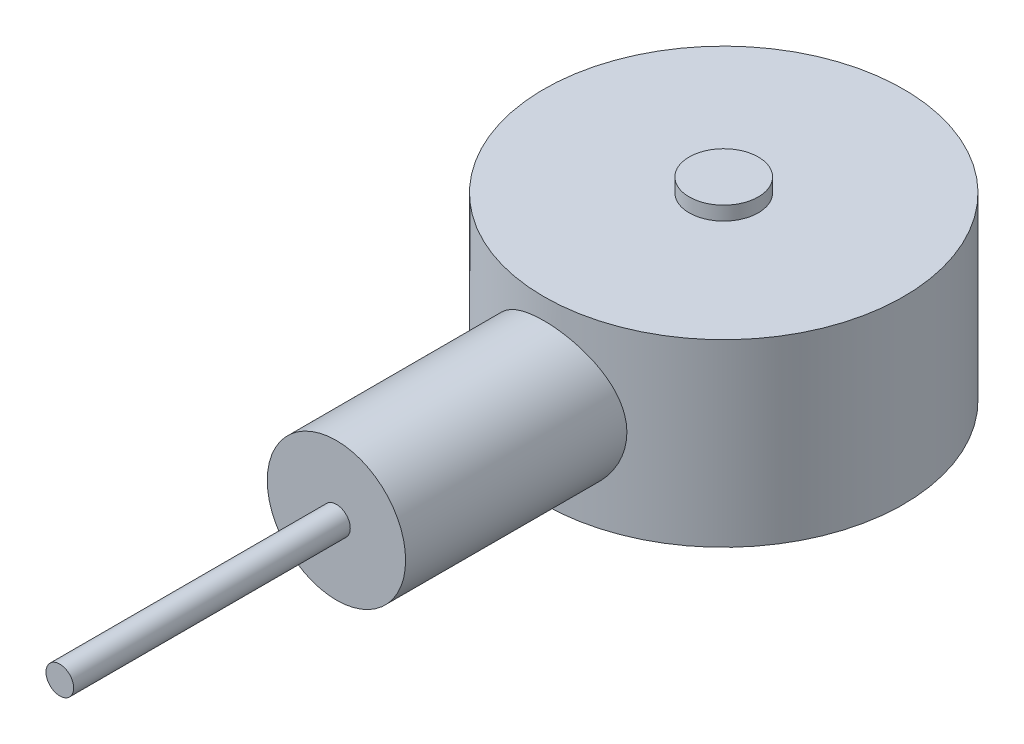
ISO-10303-21;
HEADER;
FILE_DESCRIPTION(('STEP AP214'),'2;1');
FILE_NAME('part.step','',(''),(''),'','','');
FILE_SCHEMA(('AUTOMOTIVE_DESIGN { 1 0 10303 214 1 1 1 1 }'));
ENDSEC;
DATA;
#1=APPLICATION_CONTEXT('core data for automotive mechanical design processes');
#2=APPLICATION_PROTOCOL_DEFINITION('international standard','automotive_design',2000,#1);
#3=PRODUCT_CONTEXT('',#1,'mechanical');
#4=PRODUCT('Part','Part','',(#3));
#5=PRODUCT_RELATED_PRODUCT_CATEGORY('part','',(#4));
#6=PRODUCT_DEFINITION_FORMATION('','',#4);
#7=PRODUCT_DEFINITION_CONTEXT('part definition',#1,'design');
#8=PRODUCT_DEFINITION('design','',#6,#7);
#9=PRODUCT_DEFINITION_SHAPE('','',#8);
#10=(LENGTH_UNIT() NAMED_UNIT(*) SI_UNIT(.MILLI.,.METRE.));
#11=(NAMED_UNIT(*) PLANE_ANGLE_UNIT() SI_UNIT($,.RADIAN.));
#12=(NAMED_UNIT(*) SI_UNIT($,.STERADIAN.) SOLID_ANGLE_UNIT());
#13=UNCERTAINTY_MEASURE_WITH_UNIT(LENGTH_MEASURE(1.E-05),#10,'distance_accuracy_value','');
#14=(GEOMETRIC_REPRESENTATION_CONTEXT(3) GLOBAL_UNCERTAINTY_ASSIGNED_CONTEXT((#13)) GLOBAL_UNIT_ASSIGNED_CONTEXT((#10,
#11,#12)) REPRESENTATION_CONTEXT('',''));
#15=CARTESIAN_POINT('',(0.,0.,0.));
#16=DIRECTION('',(0.,0.,1.));
#17=DIRECTION('',(1.,0.,0.));
#18=AXIS2_PLACEMENT_3D('',#15,#16,#17);
#19=CARTESIAN_POINT('',(0.,6.5,0.));
#20=DIRECTION('',(0.,-1.,0.));
#21=DIRECTION('',(0.,0.,-1.));
#22=AXIS2_PLACEMENT_3D('',#19,#20,#21);
#23=CYLINDRICAL_SURFACE('',#22,6.5);
#24=CARTESIAN_POINT('',(0.,6.5,0.));
#25=DIRECTION('',(0.,1.,0.));
#26=DIRECTION('',(0.,0.,1.));
#27=AXIS2_PLACEMENT_3D('',#24,#25,#26);
#28=CIRCLE('',#27,6.5);
#29=CARTESIAN_POINT('',(0.,6.5,6.5));
#30=VERTEX_POINT('',#29);
#31=EDGE_CURVE('E58',#30,#30,#28,.T.);
#32=ORIENTED_EDGE('',*,*,#31,.F.);
#33=EDGE_LOOP('',(#32));
#34=FACE_BOUND('',#33,.T.);
#35=CARTESIAN_POINT('',(0.,0.,0.));
#36=DIRECTION('',(0.,1.,0.));
#37=DIRECTION('',(0.,0.,1.));
#38=AXIS2_PLACEMENT_3D('',#35,#36,#37);
#39=CIRCLE('',#38,6.5);
#40=CARTESIAN_POINT('',(0.,0.,6.5));
#41=VERTEX_POINT('',#40);
#42=EDGE_CURVE('E69',#41,#41,#39,.T.);
#43=ORIENTED_EDGE('',*,*,#42,.T.);
#44=EDGE_LOOP('',(#43));
#45=FACE_BOUND('',#44,.T.);
#46=CARTESIAN_POINT('',(-2.5,3.25,6.));
#47=CARTESIAN_POINT('',(-2.50000639490342,3.11527619256474,5.99999386002488));
#48=CARTESIAN_POINT('',(-2.48907371273065,2.98059317170936,6.00458674411208));
#49=CARTESIAN_POINT('',(-2.44584466543638,2.71530447062176,6.02232393990768));
#50=CARTESIAN_POINT('',(-2.4135497730081,2.58469850997028,6.0354676621273));
#51=CARTESIAN_POINT('',(-2.32897022375862,2.33147570499575,6.06860207556173));
#52=CARTESIAN_POINT('',(-2.27673571464118,2.20883971456321,6.0885755769997));
#53=CARTESIAN_POINT('',(-2.15393856888431,1.97402295660682,6.13309065107009));
#54=CARTESIAN_POINT('',(-2.08337013616499,1.86184551071058,6.15763366761079));
#55=CARTESIAN_POINT('',(-1.92195259254876,1.64525803398529,6.2099612436925));
#56=CARTESIAN_POINT('',(-1.83029787556408,1.5414720855574,6.23784450123125));
#57=CARTESIAN_POINT('',(-1.63101634728023,1.35030066924962,6.29288986860857));
#58=CARTESIAN_POINT('',(-1.52338590698923,1.26291893793744,6.32005181293903));
#59=CARTESIAN_POINT('',(-1.2904279054746,1.10398586051322,6.37177500672378));
#60=CARTESIAN_POINT('',(-1.16460214845668,1.0331189648306,6.39620715946827));
#61=CARTESIAN_POINT('',(-0.90170784472372,0.91382019359373,6.43852552351204));
#62=CARTESIAN_POINT('',(-0.764643437823256,0.865380100323234,6.4564141320171));
#63=CARTESIAN_POINT('',(-0.489727941673925,0.794517065406474,6.48292871353059));
#64=CARTESIAN_POINT('',(-0.352191684303711,0.7710183529558,6.49193637259546));
#65=CARTESIAN_POINT('',(-0.0748525358009537,0.747251702075308,6.50104762843993));
#66=CARTESIAN_POINT('',(0.0649495635698722,0.746975816688355,6.50115427118773));
#67=CARTESIAN_POINT('',(0.335116757293545,0.769050089306196,6.4926902734952));
#68=CARTESIAN_POINT('',(0.465594546057815,0.790224417025909,6.48457057186451));
#69=CARTESIAN_POINT('',(0.720980285212545,0.852611783948533,6.46116386742904));
#70=CARTESIAN_POINT('',(0.845887838473484,0.893826249425989,6.44587635448748));
#71=CARTESIAN_POINT('',(1.08878559067003,0.995637702014048,6.40935769235675));
#72=CARTESIAN_POINT('',(1.20664622077232,1.05651223571002,6.38804201273368));
#73=CARTESIAN_POINT('',(1.43077711987204,1.19566501245736,6.34160834130924));
#74=CARTESIAN_POINT('',(1.5370435322839,1.27394902027498,6.31648909091993));
#75=CARTESIAN_POINT('',(1.74187281078255,1.45129640883671,6.26320676610052));
#76=CARTESIAN_POINT('',(1.83956539815003,1.55133871537269,6.23495149352157));
#77=CARTESIAN_POINT('',(2.01712583277251,1.76653420474333,6.17979509120995));
#78=CARTESIAN_POINT('',(2.09698871252403,1.88169158460711,6.1528943404709));
#79=CARTESIAN_POINT('',(2.23840678247172,2.12745374016498,6.10289409299379));
#80=CARTESIAN_POINT('',(2.29946767299328,2.25836689208487,6.07990337282186));
#81=CARTESIAN_POINT('',(2.398341302324,2.52973624660682,6.04158955460718));
#82=CARTESIAN_POINT('',(2.43616778910801,2.67018675113568,6.02626192325702));
#83=CARTESIAN_POINT('',(2.48546738997328,2.94801021964008,6.00609067284159));
#84=CARTESIAN_POINT('',(2.49833018457626,3.08509611902236,6.00069512779704));
#85=CARTESIAN_POINT('',(2.50136333225793,3.35954375026086,5.99943256877244));
#86=CARTESIAN_POINT('',(2.49153979182087,3.49690539794997,6.00356299068601));
#87=CARTESIAN_POINT('',(2.45074126957983,3.76065961092342,6.02032415078989));
#88=CARTESIAN_POINT('',(2.42086979020824,3.88725442761451,6.03251094056448));
#89=CARTESIAN_POINT('',(2.34222797092887,4.13356762691234,6.06347598620042));
#90=CARTESIAN_POINT('',(2.29345363802678,4.2532845505099,6.08225563464275));
#91=CARTESIAN_POINT('',(2.1762722365898,4.48760270163157,6.12518287533367));
#92=CARTESIAN_POINT('',(2.10717827150453,4.60182650910213,6.1495101200434));
#93=CARTESIAN_POINT('',(1.95203872035128,4.81754969527832,6.20050030124767));
#94=CARTESIAN_POINT('',(1.86598665709403,4.91904418767402,6.22716412803801));
#95=CARTESIAN_POINT('',(1.67252651917273,5.11351907481874,6.28199111370008));
#96=CARTESIAN_POINT('',(1.56407091792227,5.2054667234142,6.31013440476242));
#97=CARTESIAN_POINT('',(1.33258484217178,5.36999465016404,6.36304141690756));
#98=CARTESIAN_POINT('',(1.20955412953702,5.44257461181743,6.3878050827583));
#99=CARTESIAN_POINT('',(0.952309331771924,5.56590035623809,6.43117875243866));
#100=CARTESIAN_POINT('',(0.818122234041351,5.616697097909,6.44980309449455));
#101=CARTESIAN_POINT('',(0.54222276612173,5.69469163138908,6.47882643559844));
#102=CARTESIAN_POINT('',(0.400514177370107,5.72190116463864,6.48922952686212));
#103=CARTESIAN_POINT('',(0.122904725062175,5.75063424911704,6.50023184586042));
#104=CARTESIAN_POINT('',(-0.0128236917256889,5.75362226853752,6.50138996816216));
#105=CARTESIAN_POINT('',(-0.282771089388337,5.73763245617492,6.49524897148856));
#106=CARTESIAN_POINT('',(-0.416990266294304,5.71865751117154,6.48795096397435));
#107=CARTESIAN_POINT('',(-0.67645358472629,5.66031705780931,6.46598247980972));
#108=CARTESIAN_POINT('',(-0.801841704904445,5.62150984495544,6.45151417421474));
#109=CARTESIAN_POINT('',(-1.04432528567042,5.5251736440085,6.41672841947928));
#110=CARTESIAN_POINT('',(-1.16141917095499,5.46764111100952,6.39640986290703));
#111=CARTESIAN_POINT('',(-1.38950762875726,5.33268488811053,6.35085639725602));
#112=CARTESIAN_POINT('',(-1.50002401104862,5.25451279865744,6.32544776909481));
#113=CARTESIAN_POINT('',(-1.70681436585496,5.08165555457761,6.2728135252061));
#114=CARTESIAN_POINT('',(-1.80308313373218,4.98696439293749,6.2455872507387));
#115=CARTESIAN_POINT('',(-1.98422674565024,4.7774406189674,6.19050183522271));
#116=CARTESIAN_POINT('',(-2.06815756545785,4.66177529315833,6.16269307882865));
#117=CARTESIAN_POINT('',(-2.21545617483329,4.41711076968553,6.11128970385034));
#118=CARTESIAN_POINT('',(-2.2788197142475,4.28810882331026,6.08769595673474));
#119=CARTESIAN_POINT('',(-2.3862209044071,4.01119193838819,6.04644656747502));
#120=CARTESIAN_POINT('',(-2.42870047993255,3.86259023612839,6.02928775776492));
#121=CARTESIAN_POINT('',(-2.4855756538983,3.55930462812891,6.0060722289102));
#122=CARTESIAN_POINT('',(-2.49999266042994,3.40462545069068,6.00000704698329));
#123=CARTESIAN_POINT('',(-2.5,3.25,6.));
#124=B_SPLINE_CURVE_WITH_KNOTS('',3,(#46,#47,#48,#49,#50,#51,#52,#53,#54,#55,#56,#57,#58,#59,
#60,#61,#62,#63,#64,#65,#66,#67,#68,#69,#70,#71,#72,#73,#74,#75,#76,#77,#78,#79,#80,#81,#82,#83,
#84,#85,#86,#87,#88,#89,#90,#91,#92,#93,#94,#95,#96,#97,#98,#99,#100,#101,#102,#103,#104,#105,
#106,#107,#108,#109,#110,#111,#112,#113,#114,#115,#116,#117,#118,#119,#120,#121,#122,#123),
.UNSPECIFIED.,.T.,.F.,(4,2,2,2,2,2,2,2,2,2,2,2,2,2,2,2,2,2,2,2,2,2,2,2,2,2,2,2,2,2,2,2,2,2,2,2,
2,2,4),(0.,0.403594888466107,0.807161956331995,1.20972067830412,1.61240682023327,
2.03426488857782,2.45621893185967,2.89338829880627,3.3303973494229,3.74767861894734,
4.1648170923411,4.56026395858599,4.95573897325877,5.35706076660982,5.75851564727971,
6.18455521058386,6.61071332430271,7.04727055742965,7.48356922682582,7.89479211556291,
8.30590432827457,8.69606414670629,9.0863064265408,9.49165498357299,9.8971586656601,
10.3299536487488,10.7627557040117,11.1945396795543,11.6261085943845,12.0313736086087,
12.4365853614446,12.8309715159234,13.2254323754417,13.6368407324512,14.0483990074831,
14.4830799390087,14.9178506386653,15.3814190715356,15.8446337231518),.UNSPECIFIED.);
#125=CARTESIAN_POINT('',(-2.5,3.25,6.));
#126=VERTEX_POINT('',#125);
#127=EDGE_CURVE('E47',#126,#126,#124,.T.);
#128=ORIENTED_EDGE('',*,*,#127,.F.);
#129=EDGE_LOOP('',(#128));
#130=FACE_BOUND('',#129,.T.);
#131=ADVANCED_FACE('F43',(#34,#45,#130),#23,.T.);
#132=CARTESIAN_POINT('',(0.,6.5,0.));
#133=DIRECTION('',(0.,1.,0.));
#134=DIRECTION('',(0.,0.,1.));
#135=AXIS2_PLACEMENT_3D('',#132,#133,#134);
#136=PLANE('',#135);
#137=CARTESIAN_POINT('',(0.,6.5,0.));
#138=DIRECTION('',(0.,1.,0.));
#139=DIRECTION('',(0.,0.,1.));
#140=AXIS2_PLACEMENT_3D('',#137,#138,#139);
#141=CIRCLE('',#140,1.25);
#142=CARTESIAN_POINT('',(0.,6.5,1.25));
#143=VERTEX_POINT('',#142);
#144=EDGE_CURVE('E65',#143,#143,#141,.T.);
#145=ORIENTED_EDGE('',*,*,#144,.F.);
#146=EDGE_LOOP('',(#145));
#147=FACE_BOUND('',#146,.T.);
#148=ORIENTED_EDGE('',*,*,#31,.T.);
#149=EDGE_LOOP('',(#148));
#150=FACE_BOUND('',#149,.T.);
#151=ADVANCED_FACE('F81',(#147,#150),#136,.T.);
#152=CARTESIAN_POINT('',(0.,0.,0.));
#153=DIRECTION('',(0.,1.,0.));
#154=DIRECTION('',(0.,0.,1.));
#155=AXIS2_PLACEMENT_3D('',#152,#153,#154);
#156=PLANE('',#155);
#157=ORIENTED_EDGE('',*,*,#42,.F.);
#158=EDGE_LOOP('',(#157));
#159=FACE_BOUND('',#158,.T.);
#160=ADVANCED_FACE('F78',(#159),#156,.F.);
#161=CARTESIAN_POINT('',(0.,7.,0.));
#162=DIRECTION('',(0.,-1.,0.));
#163=DIRECTION('',(0.,0.,-1.));
#164=AXIS2_PLACEMENT_3D('',#161,#162,#163);
#165=CYLINDRICAL_SURFACE('',#164,1.25);
#166=CARTESIAN_POINT('',(0.,7.,0.));
#167=DIRECTION('',(0.,1.,0.));
#168=DIRECTION('',(0.,0.,1.));
#169=AXIS2_PLACEMENT_3D('',#166,#167,#168);
#170=CIRCLE('',#169,1.25);
#171=CARTESIAN_POINT('',(0.,7.,1.25));
#172=VERTEX_POINT('',#171);
#173=EDGE_CURVE('E66',#172,#172,#170,.T.);
#174=ORIENTED_EDGE('',*,*,#173,.F.);
#175=EDGE_LOOP('',(#174));
#176=FACE_BOUND('',#175,.T.);
#177=ORIENTED_EDGE('',*,*,#144,.T.);
#178=EDGE_LOOP('',(#177));
#179=FACE_BOUND('',#178,.T.);
#180=ADVANCED_FACE('F80',(#176,#179),#165,.T.);
#181=CARTESIAN_POINT('',(0.,7.,0.));
#182=DIRECTION('',(0.,1.,0.));
#183=DIRECTION('',(0.,0.,1.));
#184=AXIS2_PLACEMENT_3D('',#181,#182,#183);
#185=PLANE('',#184);
#186=ORIENTED_EDGE('',*,*,#173,.T.);
#187=EDGE_LOOP('',(#186));
#188=FACE_BOUND('',#187,.T.);
#189=ADVANCED_FACE('F86',(#188),#185,.T.);
#190=CARTESIAN_POINT('',(0.,3.25,14.));
#191=DIRECTION('',(0.,0.,-1.));
#192=DIRECTION('',(-1.,0.,0.));
#193=AXIS2_PLACEMENT_3D('',#190,#191,#192);
#194=CYLINDRICAL_SURFACE('',#193,2.5);
#195=CARTESIAN_POINT('',(0.,3.25,14.));
#196=DIRECTION('',(0.,0.,1.));
#197=DIRECTION('',(1.,0.,0.));
#198=AXIS2_PLACEMENT_3D('',#195,#196,#197);
#199=CIRCLE('',#198,2.5);
#200=CARTESIAN_POINT('',(2.5,3.25,14.));
#201=VERTEX_POINT('',#200);
#202=EDGE_CURVE('E62',#201,#201,#199,.T.);
#203=ORIENTED_EDGE('',*,*,#202,.F.);
#204=EDGE_LOOP('',(#203));
#205=FACE_BOUND('',#204,.T.);
#206=ORIENTED_EDGE('',*,*,#127,.T.);
#207=EDGE_LOOP('',(#206));
#208=FACE_BOUND('',#207,.T.);
#209=ADVANCED_FACE('F118',(#205,#208),#194,.T.);
#210=CARTESIAN_POINT('',(0.,3.25,14.));
#211=DIRECTION('',(0.,0.,1.));
#212=DIRECTION('',(1.,0.,0.));
#213=AXIS2_PLACEMENT_3D('',#210,#211,#212);
#214=PLANE('',#213);
#215=CARTESIAN_POINT('',(0.,3.25,14.));
#216=DIRECTION('',(0.,0.,1.));
#217=DIRECTION('',(1.,0.,0.));
#218=AXIS2_PLACEMENT_3D('',#215,#216,#217);
#219=CIRCLE('',#218,0.5);
#220=CARTESIAN_POINT('',(0.5,3.25,14.));
#221=VERTEX_POINT('',#220);
#222=EDGE_CURVE('E12',#221,#221,#219,.T.);
#223=ORIENTED_EDGE('',*,*,#222,.F.);
#224=EDGE_LOOP('',(#223));
#225=FACE_BOUND('',#224,.T.);
#226=ORIENTED_EDGE('',*,*,#202,.T.);
#227=EDGE_LOOP('',(#226));
#228=FACE_BOUND('',#227,.T.);
#229=ADVANCED_FACE('F127',(#225,#228),#214,.T.);
#230=CARTESIAN_POINT('',(0.,3.25,24.));
#231=DIRECTION('',(0.,0.,-1.));
#232=DIRECTION('',(-1.,0.,0.));
#233=AXIS2_PLACEMENT_3D('',#230,#231,#232);
#234=CYLINDRICAL_SURFACE('',#233,0.5);
#235=CARTESIAN_POINT('',(0.,3.25,24.));
#236=DIRECTION('',(0.,0.,1.));
#237=DIRECTION('',(1.,0.,0.));
#238=AXIS2_PLACEMENT_3D('',#235,#236,#237);
#239=CIRCLE('',#238,0.5);
#240=CARTESIAN_POINT('',(0.5,3.25,24.));
#241=VERTEX_POINT('',#240);
#242=EDGE_CURVE('E61',#241,#241,#239,.T.);
#243=ORIENTED_EDGE('',*,*,#242,.F.);
#244=EDGE_LOOP('',(#243));
#245=FACE_BOUND('',#244,.T.);
#246=ORIENTED_EDGE('',*,*,#222,.T.);
#247=EDGE_LOOP('',(#246));
#248=FACE_BOUND('',#247,.T.);
#249=ADVANCED_FACE('F134',(#245,#248),#234,.T.);
#250=CARTESIAN_POINT('',(0.,3.25,24.));
#251=DIRECTION('',(0.,0.,1.));
#252=DIRECTION('',(1.,0.,0.));
#253=AXIS2_PLACEMENT_3D('',#250,#251,#252);
#254=PLANE('',#253);
#255=ORIENTED_EDGE('',*,*,#242,.T.);
#256=EDGE_LOOP('',(#255));
#257=FACE_BOUND('',#256,.T.);
#258=ADVANCED_FACE('F142',(#257),#254,.T.);
#259=CLOSED_SHELL('',(#131,#151,#160,#180,#189,#209,#229,#249,#258));
#260=MANIFOLD_SOLID_BREP('B2',#259);
#261=ADVANCED_BREP_SHAPE_REPRESENTATION('',(#18,#260),#14);
#262=SHAPE_DEFINITION_REPRESENTATION(#9,#261);
ENDSEC;
END-ISO-10303-21;
